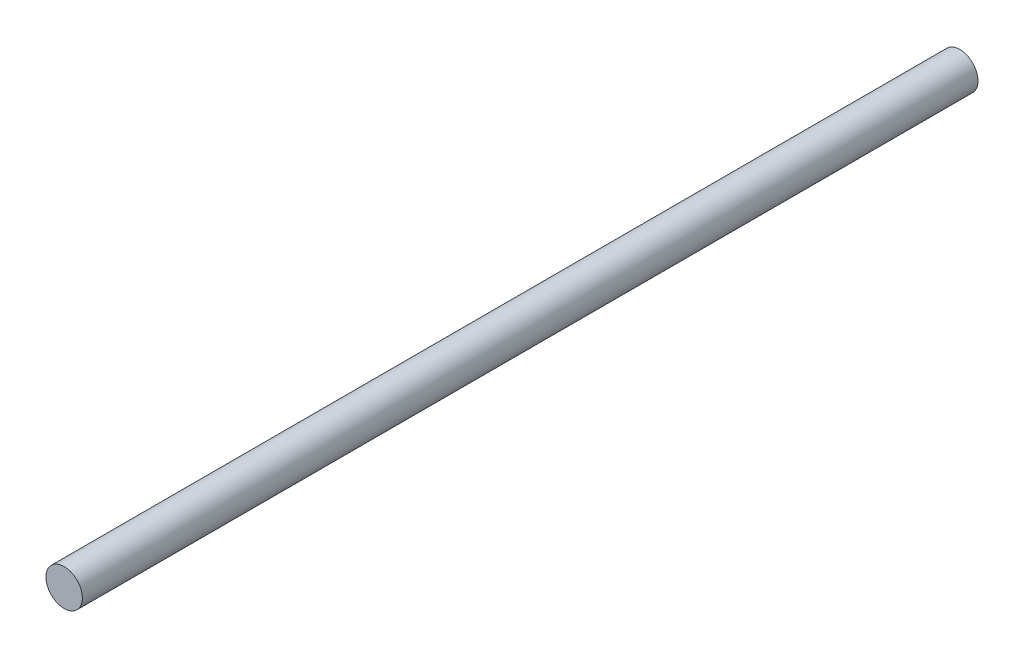
ISO-10303-21;
HEADER;
FILE_DESCRIPTION(('STEP AP214'),'2;1');
FILE_NAME('part.step','',(''),(''),'','','');
FILE_SCHEMA(('AUTOMOTIVE_DESIGN { 1 0 10303 214 1 1 1 1 }'));
ENDSEC;
DATA;
#1=APPLICATION_CONTEXT('core data for automotive mechanical design processes');
#2=APPLICATION_PROTOCOL_DEFINITION('international standard','automotive_design',2000,#1);
#3=PRODUCT_CONTEXT('',#1,'mechanical');
#4=PRODUCT('Part','Part','',(#3));
#5=PRODUCT_RELATED_PRODUCT_CATEGORY('part','',(#4));
#6=PRODUCT_DEFINITION_FORMATION('','',#4);
#7=PRODUCT_DEFINITION_CONTEXT('part definition',#1,'design');
#8=PRODUCT_DEFINITION('design','',#6,#7);
#9=PRODUCT_DEFINITION_SHAPE('','',#8);
#10=(LENGTH_UNIT() NAMED_UNIT(*) SI_UNIT(.MILLI.,.METRE.));
#11=(NAMED_UNIT(*) PLANE_ANGLE_UNIT() SI_UNIT($,.RADIAN.));
#12=(NAMED_UNIT(*) SI_UNIT($,.STERADIAN.) SOLID_ANGLE_UNIT());
#13=UNCERTAINTY_MEASURE_WITH_UNIT(LENGTH_MEASURE(1.E-05),#10,'distance_accuracy_value','');
#14=(GEOMETRIC_REPRESENTATION_CONTEXT(3) GLOBAL_UNCERTAINTY_ASSIGNED_CONTEXT((#13)) GLOBAL_UNIT_ASSIGNED_CONTEXT((#10,
#11,#12)) REPRESENTATION_CONTEXT('',''));
#15=CARTESIAN_POINT('',(0.,0.,0.));
#16=DIRECTION('',(0.,0.,1.));
#17=DIRECTION('',(1.,0.,0.));
#18=AXIS2_PLACEMENT_3D('',#15,#16,#17);
#19=CARTESIAN_POINT('',(0.,0.,187.));
#20=DIRECTION('',(0.,0.,-1.));
#21=DIRECTION('',(-1.,0.,0.));
#22=AXIS2_PLACEMENT_3D('',#19,#20,#21);
#23=CYLINDRICAL_SURFACE('',#22,3.8);
#24=CARTESIAN_POINT('',(0.,0.,187.));
#25=DIRECTION('',(0.,0.,1.));
#26=DIRECTION('',(1.,0.,0.));
#27=AXIS2_PLACEMENT_3D('',#24,#25,#26);
#28=CIRCLE('',#27,3.8);
#29=CARTESIAN_POINT('',(3.8,0.,187.));
#30=VERTEX_POINT('',#29);
#31=EDGE_CURVE('E10',#30,#30,#28,.T.);
#32=ORIENTED_EDGE('',*,*,#31,.F.);
#33=EDGE_LOOP('',(#32));
#34=FACE_BOUND('',#33,.T.);
#35=CARTESIAN_POINT('',(0.,0.,0.));
#36=DIRECTION('',(0.,0.,1.));
#37=DIRECTION('',(1.,0.,0.));
#38=AXIS2_PLACEMENT_3D('',#35,#36,#37);
#39=CIRCLE('',#38,3.8);
#40=CARTESIAN_POINT('',(3.8,0.,0.));
#41=VERTEX_POINT('',#40);
#42=EDGE_CURVE('E40',#41,#41,#39,.T.);
#43=ORIENTED_EDGE('',*,*,#42,.T.);
#44=EDGE_LOOP('',(#43));
#45=FACE_BOUND('',#44,.T.);
#46=ADVANCED_FACE('F37',(#34,#45),#23,.T.);
#47=CARTESIAN_POINT('',(0.,0.,187.));
#48=DIRECTION('',(0.,0.,1.));
#49=DIRECTION('',(1.,0.,0.));
#50=AXIS2_PLACEMENT_3D('',#47,#48,#49);
#51=PLANE('',#50);
#52=ORIENTED_EDGE('',*,*,#31,.T.);
#53=EDGE_LOOP('',(#52));
#54=FACE_BOUND('',#53,.T.);
#55=ADVANCED_FACE('F52',(#54),#51,.T.);
#56=CARTESIAN_POINT('',(0.,0.,0.));
#57=DIRECTION('',(0.,0.,1.));
#58=DIRECTION('',(1.,0.,0.));
#59=AXIS2_PLACEMENT_3D('',#56,#57,#58);
#60=PLANE('',#59);
#61=ORIENTED_EDGE('',*,*,#42,.F.);
#62=EDGE_LOOP('',(#61));
#63=FACE_BOUND('',#62,.T.);
#64=ADVANCED_FACE('F50',(#63),#60,.F.);
#65=CLOSED_SHELL('',(#46,#55,#64));
#66=MANIFOLD_SOLID_BREP('B2',#65);
#67=ADVANCED_BREP_SHAPE_REPRESENTATION('',(#18,#66),#14);
#68=SHAPE_DEFINITION_REPRESENTATION(#9,#67);
ENDSEC;
END-ISO-10303-21;
